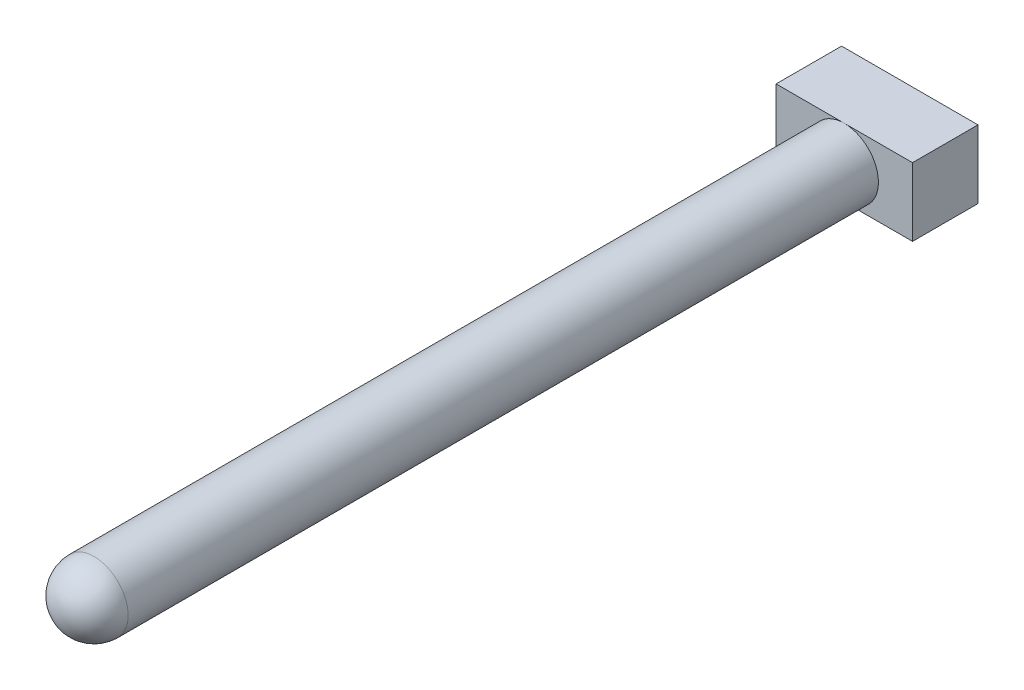
ISO-10303-21;
HEADER;
FILE_DESCRIPTION(('STEP AP214'),'2;1');
FILE_NAME('part.step','',(''),(''),'','','');
FILE_SCHEMA(('AUTOMOTIVE_DESIGN { 1 0 10303 214 1 1 1 1 }'));
ENDSEC;
DATA;
#1=APPLICATION_CONTEXT('core data for automotive mechanical design processes');
#2=APPLICATION_PROTOCOL_DEFINITION('international standard','automotive_design',2000,#1);
#3=PRODUCT_CONTEXT('',#1,'mechanical');
#4=PRODUCT('Part','Part','',(#3));
#5=PRODUCT_RELATED_PRODUCT_CATEGORY('part','',(#4));
#6=PRODUCT_DEFINITION_FORMATION('','',#4);
#7=PRODUCT_DEFINITION_CONTEXT('part definition',#1,'design');
#8=PRODUCT_DEFINITION('design','',#6,#7);
#9=PRODUCT_DEFINITION_SHAPE('','',#8);
#10=(LENGTH_UNIT() NAMED_UNIT(*) SI_UNIT(.MILLI.,.METRE.));
#11=(NAMED_UNIT(*) PLANE_ANGLE_UNIT() SI_UNIT($,.RADIAN.));
#12=(NAMED_UNIT(*) SI_UNIT($,.STERADIAN.) SOLID_ANGLE_UNIT());
#13=UNCERTAINTY_MEASURE_WITH_UNIT(LENGTH_MEASURE(1.E-05),#10,'distance_accuracy_value','');
#14=(GEOMETRIC_REPRESENTATION_CONTEXT(3) GLOBAL_UNCERTAINTY_ASSIGNED_CONTEXT((#13)) GLOBAL_UNIT_ASSIGNED_CONTEXT((#10,
#11,#12)) REPRESENTATION_CONTEXT('',''));
#15=CARTESIAN_POINT('',(0.,0.,0.));
#16=DIRECTION('',(0.,0.,1.));
#17=DIRECTION('',(1.,0.,0.));
#18=AXIS2_PLACEMENT_3D('',#15,#16,#17);
#19=CARTESIAN_POINT('',(0.,0.,6.096));
#20=DIRECTION('',(0.,0.,-1.));
#21=DIRECTION('',(-1.,0.,0.));
#22=AXIS2_PLACEMENT_3D('',#19,#20,#21);
#23=PLANE('',#22);
#24=CARTESIAN_POINT('',(6.35,3.175,6.096));
#25=DIRECTION('',(0.,0.,1.));
#26=DIRECTION('',(1.,0.,0.));
#27=AXIS2_PLACEMENT_3D('',#24,#25,#26);
#28=CIRCLE('',#27,3.175);
#29=CARTESIAN_POINT('',(6.35,6.35,6.096));
#30=VERTEX_POINT('',#29);
#31=CARTESIAN_POINT('',(6.35,0.,6.096));
#32=VERTEX_POINT('',#31);
#33=EDGE_CURVE('E51',#30,#32,#28,.T.);
#34=ORIENTED_EDGE('',*,*,#33,.F.);
#35=DIRECTION('',(-1.,0.,0.));
#36=VECTOR('',#35,1.);
#37=CARTESIAN_POINT('',(0.,6.35,6.096));
#38=LINE('',#37,#36);
#39=CARTESIAN_POINT('',(0.,6.35,6.096));
#40=VERTEX_POINT('',#39);
#41=EDGE_CURVE('E65',#30,#40,#38,.T.);
#42=ORIENTED_EDGE('',*,*,#41,.T.);
#43=DIRECTION('',(0.,-1.,0.));
#44=VECTOR('',#43,1.);
#45=CARTESIAN_POINT('',(0.,0.,6.096));
#46=LINE('',#45,#44);
#47=CARTESIAN_POINT('',(0.,0.,6.096));
#48=VERTEX_POINT('',#47);
#49=EDGE_CURVE('E158',#40,#48,#46,.T.);
#50=ORIENTED_EDGE('',*,*,#49,.T.);
#51=DIRECTION('',(1.,0.,0.));
#52=VECTOR('',#51,1.);
#53=CARTESIAN_POINT('',(0.,0.,6.096));
#54=LINE('',#53,#52);
#55=EDGE_CURVE('E94',#48,#32,#54,.T.);
#56=ORIENTED_EDGE('',*,*,#55,.T.);
#57=EDGE_LOOP('',(#34,#42,#50,#56));
#58=FACE_BOUND('',#57,.T.);
#59=ADVANCED_FACE('F41',(#58),#23,.F.);
#60=CARTESIAN_POINT('',(0.,0.,6.096));
#61=DIRECTION('',(1.,0.,0.));
#62=DIRECTION('',(0.,0.,-1.));
#63=AXIS2_PLACEMENT_3D('',#60,#61,#62);
#64=PLANE('',#63);
#65=DIRECTION('',(0.,-1.,0.));
#66=VECTOR('',#65,1.);
#67=CARTESIAN_POINT('',(0.,0.,0.));
#68=LINE('',#67,#66);
#69=CARTESIAN_POINT('',(0.,6.35,0.));
#70=VERTEX_POINT('',#69);
#71=CARTESIAN_POINT('',(0.,0.,0.));
#72=VERTEX_POINT('',#71);
#73=EDGE_CURVE('E154',#70,#72,#68,.T.);
#74=ORIENTED_EDGE('',*,*,#73,.T.);
#75=DIRECTION('',(0.,0.,-1.));
#76=VECTOR('',#75,1.);
#77=CARTESIAN_POINT('',(0.,0.,6.096));
#78=LINE('',#77,#76);
#79=EDGE_CURVE('E45',#48,#72,#78,.T.);
#80=ORIENTED_EDGE('',*,*,#79,.F.);
#81=ORIENTED_EDGE('',*,*,#49,.F.);
#82=DIRECTION('',(0.,0.,-1.));
#83=VECTOR('',#82,1.);
#84=CARTESIAN_POINT('',(0.,6.35,6.096));
#85=LINE('',#84,#83);
#86=EDGE_CURVE('E102',#40,#70,#85,.T.);
#87=ORIENTED_EDGE('',*,*,#86,.T.);
#88=EDGE_LOOP('',(#74,#80,#81,#87));
#89=FACE_BOUND('',#88,.T.);
#90=ADVANCED_FACE('F43',(#89),#64,.F.);
#91=CARTESIAN_POINT('',(0.,0.,6.096));
#92=DIRECTION('',(0.,1.,0.));
#93=DIRECTION('',(0.,0.,1.));
#94=AXIS2_PLACEMENT_3D('',#91,#92,#93);
#95=PLANE('',#94);
#96=DIRECTION('',(1.,0.,0.));
#97=VECTOR('',#96,1.);
#98=CARTESIAN_POINT('',(0.,0.,0.));
#99=LINE('',#98,#97);
#100=CARTESIAN_POINT('',(12.7,0.,0.));
#101=VERTEX_POINT('',#100);
#102=EDGE_CURVE('E146',#72,#101,#99,.T.);
#103=ORIENTED_EDGE('',*,*,#102,.T.);
#104=DIRECTION('',(0.,0.,-1.));
#105=VECTOR('',#104,1.);
#106=CARTESIAN_POINT('',(12.7,0.,6.096));
#107=LINE('',#106,#105);
#108=CARTESIAN_POINT('',(12.7,0.,6.096));
#109=VERTEX_POINT('',#108);
#110=EDGE_CURVE('E148',#109,#101,#107,.T.);
#111=ORIENTED_EDGE('',*,*,#110,.F.);
#112=EDGE_CURVE('E168',#32,#109,#54,.T.);
#113=ORIENTED_EDGE('',*,*,#112,.F.);
#114=ORIENTED_EDGE('',*,*,#55,.F.);
#115=ORIENTED_EDGE('',*,*,#79,.T.);
#116=EDGE_LOOP('',(#103,#111,#113,#114,#115));
#117=FACE_BOUND('',#116,.T.);
#118=ADVANCED_FACE('F131',(#117),#95,.F.);
#119=CARTESIAN_POINT('',(12.7,0.,6.096));
#120=DIRECTION('',(-1.,0.,0.));
#121=DIRECTION('',(0.,0.,1.));
#122=AXIS2_PLACEMENT_3D('',#119,#120,#121);
#123=PLANE('',#122);
#124=DIRECTION('',(0.,1.,0.));
#125=VECTOR('',#124,1.);
#126=CARTESIAN_POINT('',(12.7,0.,0.));
#127=LINE('',#126,#125);
#128=CARTESIAN_POINT('',(12.7,6.35,0.));
#129=VERTEX_POINT('',#128);
#130=EDGE_CURVE('E153',#101,#129,#127,.T.);
#131=ORIENTED_EDGE('',*,*,#130,.T.);
#132=DIRECTION('',(0.,0.,-1.));
#133=VECTOR('',#132,1.);
#134=CARTESIAN_POINT('',(12.7,6.35,6.096));
#135=LINE('',#134,#133);
#136=CARTESIAN_POINT('',(12.7,6.35,6.096));
#137=VERTEX_POINT('',#136);
#138=EDGE_CURVE('E156',#137,#129,#135,.T.);
#139=ORIENTED_EDGE('',*,*,#138,.F.);
#140=DIRECTION('',(0.,1.,0.));
#141=VECTOR('',#140,1.);
#142=CARTESIAN_POINT('',(12.7,0.,6.096));
#143=LINE('',#142,#141);
#144=EDGE_CURVE('E100',#109,#137,#143,.T.);
#145=ORIENTED_EDGE('',*,*,#144,.F.);
#146=ORIENTED_EDGE('',*,*,#110,.T.);
#147=EDGE_LOOP('',(#131,#139,#145,#146));
#148=FACE_BOUND('',#147,.T.);
#149=ADVANCED_FACE('F136',(#148),#123,.F.);
#150=CARTESIAN_POINT('',(0.,6.35,6.096));
#151=DIRECTION('',(0.,-1.,0.));
#152=DIRECTION('',(0.,0.,-1.));
#153=AXIS2_PLACEMENT_3D('',#150,#151,#152);
#154=PLANE('',#153);
#155=DIRECTION('',(-1.,0.,0.));
#156=VECTOR('',#155,1.);
#157=CARTESIAN_POINT('',(0.,6.35,0.));
#158=LINE('',#157,#156);
#159=EDGE_CURVE('E87',#129,#70,#158,.T.);
#160=ORIENTED_EDGE('',*,*,#159,.T.);
#161=ORIENTED_EDGE('',*,*,#86,.F.);
#162=ORIENTED_EDGE('',*,*,#41,.F.);
#163=EDGE_CURVE('E97',#137,#30,#38,.T.);
#164=ORIENTED_EDGE('',*,*,#163,.F.);
#165=ORIENTED_EDGE('',*,*,#138,.T.);
#166=EDGE_LOOP('',(#160,#161,#162,#164,#165));
#167=FACE_BOUND('',#166,.T.);
#168=ADVANCED_FACE('F104',(#167),#154,.F.);
#169=EDGE_CURVE('E11',#32,#30,#28,.T.);
#170=ORIENTED_EDGE('',*,*,#169,.F.);
#171=ORIENTED_EDGE('',*,*,#112,.T.);
#172=ORIENTED_EDGE('',*,*,#144,.T.);
#173=ORIENTED_EDGE('',*,*,#163,.T.);
#174=EDGE_LOOP('',(#170,#171,#172,#173));
#175=FACE_BOUND('',#174,.T.);
#176=ADVANCED_FACE('F98',(#175),#23,.F.);
#177=CARTESIAN_POINT('',(0.,0.,0.));
#178=DIRECTION('',(0.,0.,-1.));
#179=DIRECTION('',(-1.,0.,0.));
#180=AXIS2_PLACEMENT_3D('',#177,#178,#179);
#181=PLANE('',#180);
#182=ORIENTED_EDGE('',*,*,#73,.F.);
#183=ORIENTED_EDGE('',*,*,#159,.F.);
#184=ORIENTED_EDGE('',*,*,#130,.F.);
#185=ORIENTED_EDGE('',*,*,#102,.F.);
#186=EDGE_LOOP('',(#182,#183,#184,#185));
#187=FACE_BOUND('',#186,.T.);
#188=ADVANCED_FACE('F112',(#187),#181,.T.);
#189=CARTESIAN_POINT('',(6.35,3.175,75.946));
#190=DIRECTION('',(0.,0.,-1.));
#191=DIRECTION('',(-1.,0.,0.));
#192=AXIS2_PLACEMENT_3D('',#189,#190,#191);
#193=CYLINDRICAL_SURFACE('',#192,3.175);
#194=CARTESIAN_POINT('',(6.35,3.175,75.946));
#195=DIRECTION('',(0.,0.,1.));
#196=DIRECTION('',(1.,0.,0.));
#197=AXIS2_PLACEMENT_3D('',#194,#195,#196);
#198=CIRCLE('',#197,3.175);
#199=CARTESIAN_POINT('',(9.525,3.175,75.946));
#200=VERTEX_POINT('',#199);
#201=EDGE_CURVE('E108',#200,#200,#198,.T.);
#202=ORIENTED_EDGE('',*,*,#201,.F.);
#203=EDGE_LOOP('',(#202));
#204=FACE_BOUND('',#203,.T.);
#205=ORIENTED_EDGE('',*,*,#33,.T.);
#206=ORIENTED_EDGE('',*,*,#169,.T.);
#207=EDGE_LOOP('',(#205,#206));
#208=FACE_BOUND('',#207,.T.);
#209=ADVANCED_FACE('F109',(#204,#208),#193,.T.);
#210=CARTESIAN_POINT('',(6.35,3.175,75.946));
#211=DIRECTION('',(0.,0.,-1.));
#212=DIRECTION('',(0.,1.,0.));
#213=AXIS2_PLACEMENT_3D('',#210,#211,#212);
#214=SPHERICAL_SURFACE('',#213,3.175);
#215=ORIENTED_EDGE('',*,*,#201,.T.);
#216=EDGE_LOOP('',(#215));
#217=FACE_BOUND('',#216,.T.);
#218=ADVANCED_FACE('F111',(#217),#214,.T.);
#219=CLOSED_SHELL('',(#59,#90,#118,#149,#168,#176,#188,#209,#218));
#220=MANIFOLD_SOLID_BREP('B2',#219);
#221=ADVANCED_BREP_SHAPE_REPRESENTATION('',(#18,#220),#14);
#222=SHAPE_DEFINITION_REPRESENTATION(#9,#221);
ENDSEC;
END-ISO-10303-21;
